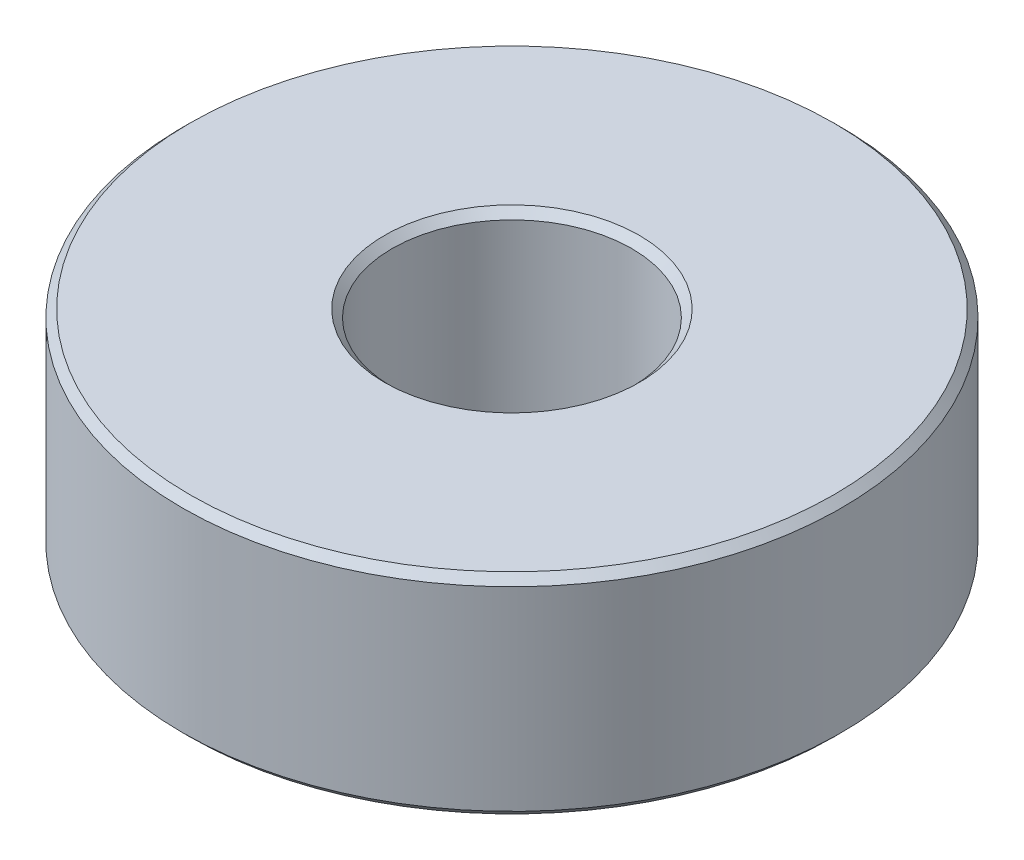
ISO-10303-21;
HEADER;
FILE_DESCRIPTION(('STEP AP214'),'2;1');
FILE_NAME('part.step','',(''),(''),'','','');
FILE_SCHEMA(('AUTOMOTIVE_DESIGN { 1 0 10303 214 1 1 1 1 }'));
ENDSEC;
DATA;
#1=APPLICATION_CONTEXT('core data for automotive mechanical design processes');
#2=APPLICATION_PROTOCOL_DEFINITION('international standard','automotive_design',2000,#1);
#3=PRODUCT_CONTEXT('',#1,'mechanical');
#4=PRODUCT('Part','Part','',(#3));
#5=PRODUCT_RELATED_PRODUCT_CATEGORY('part','',(#4));
#6=PRODUCT_DEFINITION_FORMATION('','',#4);
#7=PRODUCT_DEFINITION_CONTEXT('part definition',#1,'design');
#8=PRODUCT_DEFINITION('design','',#6,#7);
#9=PRODUCT_DEFINITION_SHAPE('','',#8);
#10=(LENGTH_UNIT() NAMED_UNIT(*) SI_UNIT(.MILLI.,.METRE.));
#11=(NAMED_UNIT(*) PLANE_ANGLE_UNIT() SI_UNIT($,.RADIAN.));
#12=(NAMED_UNIT(*) SI_UNIT($,.STERADIAN.) SOLID_ANGLE_UNIT());
#13=UNCERTAINTY_MEASURE_WITH_UNIT(LENGTH_MEASURE(1.E-05),#10,'distance_accuracy_value','');
#14=(GEOMETRIC_REPRESENTATION_CONTEXT(3) GLOBAL_UNCERTAINTY_ASSIGNED_CONTEXT((#13)) GLOBAL_UNIT_ASSIGNED_CONTEXT((#10,
#11,#12)) REPRESENTATION_CONTEXT('',''));
#15=CARTESIAN_POINT('',(0.,0.,0.));
#16=DIRECTION('',(0.,0.,1.));
#17=DIRECTION('',(1.,0.,0.));
#18=AXIS2_PLACEMENT_3D('',#15,#16,#17);
#19=CARTESIAN_POINT('',(0.,7.,0.));
#20=DIRECTION('',(0.,1.,0.));
#21=DIRECTION('',(0.,0.,1.));
#22=AXIS2_PLACEMENT_3D('',#19,#20,#21);
#23=PLANE('',#22);
#24=CARTESIAN_POINT('',(0.,7.,0.));
#25=DIRECTION('',(0.,1.,0.));
#26=DIRECTION('',(0.,0.,1.));
#27=AXIS2_PLACEMENT_3D('',#24,#25,#26);
#28=CIRCLE('',#27,4.25400000000001);
#29=CARTESIAN_POINT('',(0.,7.,4.25400000000001));
#30=VERTEX_POINT('',#29);
#31=EDGE_CURVE('E10',#30,#30,#28,.F.);
#32=ORIENTED_EDGE('',*,*,#31,.T.);
#33=EDGE_LOOP('',(#32));
#34=FACE_BOUND('',#33,.T.);
#35=CARTESIAN_POINT('',(0.,7.,0.));
#36=DIRECTION('',(0.,1.,0.));
#37=DIRECTION('',(0.,0.,1.));
#38=AXIS2_PLACEMENT_3D('',#35,#36,#37);
#39=CIRCLE('',#38,10.746);
#40=CARTESIAN_POINT('',(0.,7.,10.746));
#41=VERTEX_POINT('',#40);
#42=EDGE_CURVE('E38',#41,#41,#39,.T.);
#43=ORIENTED_EDGE('',*,*,#42,.T.);
#44=EDGE_LOOP('',(#43));
#45=FACE_BOUND('',#44,.T.);
#46=ADVANCED_FACE('F31',(#34,#45),#23,.T.);
#47=CARTESIAN_POINT('',(0.,0.,0.));
#48=DIRECTION('',(0.,1.,0.));
#49=DIRECTION('',(0.,0.,1.));
#50=AXIS2_PLACEMENT_3D('',#47,#48,#49);
#51=PLANE('',#50);
#52=CARTESIAN_POINT('',(0.,0.,0.));
#53=DIRECTION('',(0.,1.,0.));
#54=DIRECTION('',(0.,0.,1.));
#55=AXIS2_PLACEMENT_3D('',#52,#53,#54);
#56=CIRCLE('',#55,4.254);
#57=CARTESIAN_POINT('',(0.,0.,4.254));
#58=VERTEX_POINT('',#57);
#59=EDGE_CURVE('E57',#58,#58,#56,.T.);
#60=ORIENTED_EDGE('',*,*,#59,.T.);
#61=EDGE_LOOP('',(#60));
#62=FACE_BOUND('',#61,.T.);
#63=CARTESIAN_POINT('',(0.,0.,0.));
#64=DIRECTION('',(0.,1.,0.));
#65=DIRECTION('',(0.,0.,1.));
#66=AXIS2_PLACEMENT_3D('',#63,#64,#65);
#67=CIRCLE('',#66,10.746);
#68=CARTESIAN_POINT('',(0.,0.,10.746));
#69=VERTEX_POINT('',#68);
#70=EDGE_CURVE('E60',#69,#69,#67,.F.);
#71=ORIENTED_EDGE('',*,*,#70,.T.);
#72=EDGE_LOOP('',(#71));
#73=FACE_BOUND('',#72,.T.);
#74=ADVANCED_FACE('F64',(#62,#73),#51,.F.);
#75=CARTESIAN_POINT('',(0.,7.,0.));
#76=DIRECTION('',(0.,-1.,0.));
#77=DIRECTION('',(0.,0.,-1.));
#78=AXIS2_PLACEMENT_3D('',#75,#76,#77);
#79=CYLINDRICAL_SURFACE('',#78,11.);
#80=CARTESIAN_POINT('',(0.,0.253999999999996,0.));
#81=DIRECTION('',(0.,1.,0.));
#82=DIRECTION('',(0.,0.,1.));
#83=AXIS2_PLACEMENT_3D('',#80,#81,#82);
#84=CIRCLE('',#83,11.);
#85=CARTESIAN_POINT('',(0.,0.253999999999996,11.));
#86=VERTEX_POINT('',#85);
#87=EDGE_CURVE('E42',#86,#86,#84,.T.);
#88=ORIENTED_EDGE('',*,*,#87,.T.);
#89=EDGE_LOOP('',(#88));
#90=FACE_BOUND('',#89,.T.);
#91=CARTESIAN_POINT('',(0.,6.746,0.));
#92=DIRECTION('',(0.,1.,0.));
#93=DIRECTION('',(0.,0.,1.));
#94=AXIS2_PLACEMENT_3D('',#91,#92,#93);
#95=CIRCLE('',#94,11.);
#96=CARTESIAN_POINT('',(0.,6.746,11.));
#97=VERTEX_POINT('',#96);
#98=EDGE_CURVE('E46',#97,#97,#95,.F.);
#99=ORIENTED_EDGE('',*,*,#98,.T.);
#100=EDGE_LOOP('',(#99));
#101=FACE_BOUND('',#100,.T.);
#102=ADVANCED_FACE('F74',(#90,#101),#79,.T.);
#103=CARTESIAN_POINT('',(0.,7.,0.));
#104=DIRECTION('',(0.,-1.,0.));
#105=DIRECTION('',(0.,0.,-1.));
#106=AXIS2_PLACEMENT_3D('',#103,#104,#105);
#107=CYLINDRICAL_SURFACE('',#106,4.);
#108=CARTESIAN_POINT('',(0.,0.253999999999997,0.));
#109=DIRECTION('',(0.,1.,0.));
#110=DIRECTION('',(0.,0.,1.));
#111=AXIS2_PLACEMENT_3D('',#108,#109,#110);
#112=CIRCLE('',#111,4.);
#113=CARTESIAN_POINT('',(0.,0.253999999999997,4.));
#114=VERTEX_POINT('',#113);
#115=EDGE_CURVE('E51',#114,#114,#112,.F.);
#116=ORIENTED_EDGE('',*,*,#115,.T.);
#117=EDGE_LOOP('',(#116));
#118=FACE_BOUND('',#117,.T.);
#119=CARTESIAN_POINT('',(0.,6.746,0.));
#120=DIRECTION('',(0.,1.,0.));
#121=DIRECTION('',(0.,0.,1.));
#122=AXIS2_PLACEMENT_3D('',#119,#120,#121);
#123=CIRCLE('',#122,4.);
#124=CARTESIAN_POINT('',(0.,6.746,4.));
#125=VERTEX_POINT('',#124);
#126=EDGE_CURVE('E54',#125,#125,#123,.T.);
#127=ORIENTED_EDGE('',*,*,#126,.T.);
#128=EDGE_LOOP('',(#127));
#129=FACE_BOUND('',#128,.T.);
#130=ADVANCED_FACE('F77',(#118,#129),#107,.F.);
#131=CARTESIAN_POINT('',(0.,0.,0.));
#132=DIRECTION('',(0.,-1.,0.));
#133=DIRECTION('',(0.,0.,-1.));
#134=AXIS2_PLACEMENT_3D('',#131,#132,#133);
#135=CONICAL_SURFACE('',#134,4.254,0.785398163397448);
#136=ORIENTED_EDGE('',*,*,#115,.F.);
#137=EDGE_LOOP('',(#136));
#138=FACE_BOUND('',#137,.T.);
#139=ORIENTED_EDGE('',*,*,#59,.F.);
#140=EDGE_LOOP('',(#139));
#141=FACE_BOUND('',#140,.T.);
#142=ADVANCED_FACE('F70',(#138,#141),#135,.F.);
#143=CARTESIAN_POINT('',(0.,0.253999999999996,0.));
#144=DIRECTION('',(0.,1.,0.));
#145=DIRECTION('',(0.,0.,1.));
#146=AXIS2_PLACEMENT_3D('',#143,#144,#145);
#147=CONICAL_SURFACE('',#146,11.,0.785398163397452);
#148=ORIENTED_EDGE('',*,*,#70,.F.);
#149=EDGE_LOOP('',(#148));
#150=FACE_BOUND('',#149,.T.);
#151=ORIENTED_EDGE('',*,*,#87,.F.);
#152=EDGE_LOOP('',(#151));
#153=FACE_BOUND('',#152,.T.);
#154=ADVANCED_FACE('F66',(#150,#153),#147,.T.);
#155=CARTESIAN_POINT('',(0.,6.746,0.));
#156=DIRECTION('',(0.,1.,0.));
#157=DIRECTION('',(0.,0.,1.));
#158=AXIS2_PLACEMENT_3D('',#155,#156,#157);
#159=CONICAL_SURFACE('',#158,4.,0.785398163397455);
#160=ORIENTED_EDGE('',*,*,#31,.F.);
#161=EDGE_LOOP('',(#160));
#162=FACE_BOUND('',#161,.T.);
#163=ORIENTED_EDGE('',*,*,#126,.F.);
#164=EDGE_LOOP('',(#163));
#165=FACE_BOUND('',#164,.T.);
#166=ADVANCED_FACE('F69',(#162,#165),#159,.F.);
#167=CARTESIAN_POINT('',(0.,7.,0.));
#168=DIRECTION('',(0.,-1.,0.));
#169=DIRECTION('',(0.,0.,-1.));
#170=AXIS2_PLACEMENT_3D('',#167,#168,#169);
#171=CONICAL_SURFACE('',#170,10.746,0.785398163397435);
#172=ORIENTED_EDGE('',*,*,#98,.F.);
#173=EDGE_LOOP('',(#172));
#174=FACE_BOUND('',#173,.T.);
#175=ORIENTED_EDGE('',*,*,#42,.F.);
#176=EDGE_LOOP('',(#175));
#177=FACE_BOUND('',#176,.T.);
#178=ADVANCED_FACE('F33',(#174,#177),#171,.T.);
#179=CLOSED_SHELL('',(#46,#74,#102,#130,#142,#154,#166,#178));
#180=MANIFOLD_SOLID_BREP('B2',#179);
#181=ADVANCED_BREP_SHAPE_REPRESENTATION('',(#18,#180),#14);
#182=SHAPE_DEFINITION_REPRESENTATION(#9,#181);
ENDSEC;
END-ISO-10303-21;
